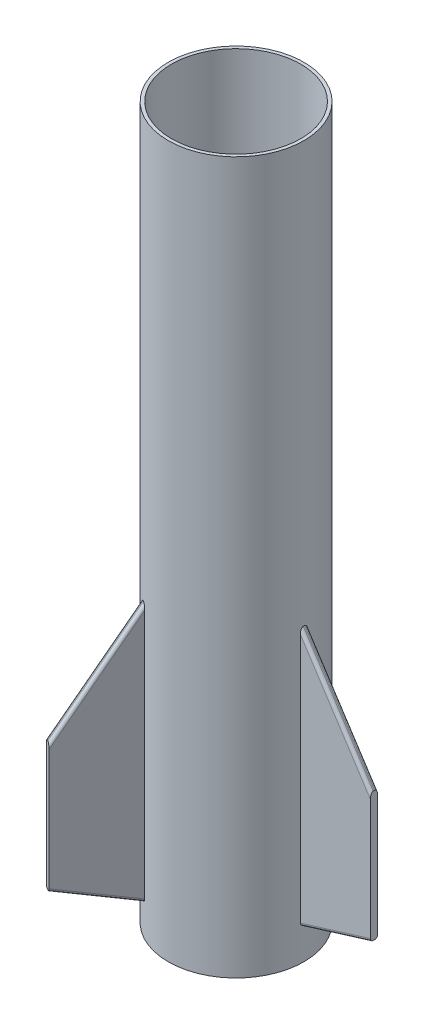
ISO-10303-21;
HEADER;
FILE_DESCRIPTION(('STEP AP214'),'2;1');
FILE_NAME('part.step','',(''),(''),'','','');
FILE_SCHEMA(('AUTOMOTIVE_DESIGN { 1 0 10303 214 1 1 1 1 }'));
ENDSEC;
DATA;
#1=APPLICATION_CONTEXT('core data for automotive mechanical design processes');
#2=APPLICATION_PROTOCOL_DEFINITION('international standard','automotive_design',2000,#1);
#3=PRODUCT_CONTEXT('',#1,'mechanical');
#4=PRODUCT('Part','Part','',(#3));
#5=PRODUCT_RELATED_PRODUCT_CATEGORY('part','',(#4));
#6=PRODUCT_DEFINITION_FORMATION('','',#4);
#7=PRODUCT_DEFINITION_CONTEXT('part definition',#1,'design');
#8=PRODUCT_DEFINITION('design','',#6,#7);
#9=PRODUCT_DEFINITION_SHAPE('','',#8);
#10=(LENGTH_UNIT() NAMED_UNIT(*) SI_UNIT(.MILLI.,.METRE.));
#11=(NAMED_UNIT(*) PLANE_ANGLE_UNIT() SI_UNIT($,.RADIAN.));
#12=(NAMED_UNIT(*) SI_UNIT($,.STERADIAN.) SOLID_ANGLE_UNIT());
#13=UNCERTAINTY_MEASURE_WITH_UNIT(LENGTH_MEASURE(1.E-05),#10,'distance_accuracy_value','');
#14=(GEOMETRIC_REPRESENTATION_CONTEXT(3) GLOBAL_UNCERTAINTY_ASSIGNED_CONTEXT((#13)) GLOBAL_UNIT_ASSIGNED_CONTEXT((#10,
#11,#12)) REPRESENTATION_CONTEXT('',''));
#15=CARTESIAN_POINT('',(0.,0.,0.));
#16=DIRECTION('',(0.,0.,1.));
#17=DIRECTION('',(1.,0.,0.));
#18=AXIS2_PLACEMENT_3D('',#15,#16,#17);
#19=CARTESIAN_POINT('',(-42.50974884677,31.75,-69.3110448195996));
#20=DIRECTION('',(-0.147042924418759,-0.95577900872195,-0.254685815986807));
#21=DIRECTION('',(-0.477889504360967,0.294085848837523,-0.827728901957122));
#22=AXIS2_PLACEMENT_3D('',#19,#20,#21);
#23=PLANE('',#22);
#24=DIRECTION('',(0.866025403784443,0.,-0.499999999999992));
#25=VECTOR('',#24,1.);
#26=CARTESIAN_POINT('',(-42.50974884677,31.75,-69.3110448195996));
#27=LINE('',#26,#25);
#28=CARTESIAN_POINT('',(-40.9699556788412,31.75,-70.2000448195996));
#29=VERTEX_POINT('',#28);
#30=CARTESIAN_POINT('',(-40.3100443211575,31.75,-70.5810448195996));
#31=VERTEX_POINT('',#30);
#32=EDGE_CURVE('E149',#29,#31,#27,.T.);
#33=ORIENTED_EDGE('',*,*,#32,.T.);
#34=DIRECTION('',(-0.477889504360967,0.294085848837523,-0.827728901957122));
#35=VECTOR('',#34,1.);
#36=CARTESIAN_POINT('',(-40.3100443211575,31.75,-70.5810448195996));
#37=LINE('',#36,#35);
#38=CARTESIAN_POINT('',(-19.6725443211578,19.05,-34.8358462783967));
#39=VERTEX_POINT('',#38);
#40=EDGE_CURVE('E117',#31,#39,#37,.F.);
#41=ORIENTED_EDGE('',*,*,#40,.T.);
#42=DIRECTION('',(0.866025403784443,0.,-0.499999999999992));
#43=VECTOR('',#42,1.);
#44=CARTESIAN_POINT('',(-21.8722488467703,19.05,-33.5658462783967));
#45=LINE('',#44,#43);
#46=CARTESIAN_POINT('',(-20.3324556788416,19.05,-34.4548462783967));
#47=VERTEX_POINT('',#46);
#48=EDGE_CURVE('E150',#47,#39,#45,.T.);
#49=ORIENTED_EDGE('',*,*,#48,.F.);
#50=DIRECTION('',(-0.477889504360967,0.294085848837523,-0.827728901957122));
#51=VECTOR('',#50,1.);
#52=CARTESIAN_POINT('',(-40.9699556788412,31.75,-70.2000448195996));
#53=LINE('',#52,#51);
#54=EDGE_CURVE('E122',#47,#29,#53,.T.);
#55=ORIENTED_EDGE('',*,*,#54,.T.);
#56=EDGE_LOOP('',(#33,#41,#49,#55));
#57=FACE_BOUND('',#56,.T.);
#58=ADVANCED_FACE('F47',(#57),#23,.T.);
#59=CARTESIAN_POINT('',(-21.8722488467703,19.05,-33.5658462783967));
#60=DIRECTION('',(0.499999999999992,0.,0.866025403784443));
#61=DIRECTION('',(0.866025403784443,0.,-0.499999999999992));
#62=AXIS2_PLACEMENT_3D('',#59,#60,#61);
#63=PLANE('',#62);
#64=ORIENTED_EDGE('',*,*,#48,.T.);
#65=CARTESIAN_POINT('',(-19.6725443211578,20.9102626588101,-34.8358462783967));
#66=DIRECTION('',(0.499999999999992,0.,0.866025403784443));
#67=DIRECTION('',(0.,1.,0.));
#68=AXIS2_PLACEMENT_3D('',#65,#66,#67);
#69=ELLIPSE('',#68,1.86026265881012,1.778);
#70=CARTESIAN_POINT('',(-18.1327511532291,20.9102626588101,-35.7248462783966));
#71=VERTEX_POINT('',#70);
#72=EDGE_CURVE('E171',#39,#71,#69,.T.);
#73=ORIENTED_EDGE('',*,*,#72,.T.);
#74=DIRECTION('',(0.,-1.,0.));
#75=VECTOR('',#74,1.);
#76=CARTESIAN_POINT('',(-18.1327511532291,19.05,-35.7248462783966));
#77=LINE('',#76,#75);
#78=CARTESIAN_POINT('',(-18.1327511532291,168.187544943745,-35.7248462783966));
#79=VERTEX_POINT('',#78);
#80=EDGE_CURVE('E133',#79,#71,#77,.T.);
#81=ORIENTED_EDGE('',*,*,#80,.F.);
#82=CARTESIAN_POINT('',(-19.6725443211578,168.187544943745,-34.8358462783967));
#83=DIRECTION('',(0.499999999999992,0.,0.866025403784443));
#84=DIRECTION('',(0.,1.,0.));
#85=AXIS2_PLACEMENT_3D('',#82,#83,#84);
#86=ELLIPSE('',#85,3.26245505625485,1.778);
#87=CARTESIAN_POINT('',(-19.6725443211578,171.45,-34.8358462783967));
#88=VERTEX_POINT('',#87);
#89=EDGE_CURVE('E167',#79,#88,#86,.T.);
#90=ORIENTED_EDGE('',*,*,#89,.T.);
#91=DIRECTION('',(0.866025403784443,0.,-0.499999999999992));
#92=VECTOR('',#91,1.);
#93=CARTESIAN_POINT('',(-21.8722488467703,171.45,-33.5658462783967));
#94=LINE('',#93,#92);
#95=CARTESIAN_POINT('',(-20.3324556788416,171.45,-34.4548462783967));
#96=VERTEX_POINT('',#95);
#97=EDGE_CURVE('E153',#96,#88,#94,.T.);
#98=ORIENTED_EDGE('',*,*,#97,.F.);
#99=CARTESIAN_POINT('',(-20.3324556788416,168.187544943745,-34.4548462783967));
#100=DIRECTION('',(0.499999999999992,0.,0.866025403784443));
#101=DIRECTION('',(0.,-1.,0.));
#102=AXIS2_PLACEMENT_3D('',#99,#100,#101);
#103=ELLIPSE('',#102,3.26245505625485,1.778);
#104=CARTESIAN_POINT('',(-21.8722488467703,168.187544943745,-33.5658462783967));
#105=VERTEX_POINT('',#104);
#106=EDGE_CURVE('E69',#96,#105,#103,.T.);
#107=ORIENTED_EDGE('',*,*,#106,.T.);
#108=DIRECTION('',(0.,-1.,0.));
#109=VECTOR('',#108,1.);
#110=CARTESIAN_POINT('',(-21.8722488467703,19.05,-33.5658462783967));
#111=LINE('',#110,#109);
#112=CARTESIAN_POINT('',(-21.8722488467703,20.9102626588101,-33.5658462783967));
#113=VERTEX_POINT('',#112);
#114=EDGE_CURVE('E147',#105,#113,#111,.T.);
#115=ORIENTED_EDGE('',*,*,#114,.T.);
#116=CARTESIAN_POINT('',(-20.3324556788416,20.9102626588101,-34.4548462783967));
#117=DIRECTION('',(0.499999999999992,0.,0.866025403784443));
#118=DIRECTION('',(0.,-1.,0.));
#119=AXIS2_PLACEMENT_3D('',#116,#117,#118);
#120=ELLIPSE('',#119,1.86026265881012,1.778);
#121=EDGE_CURVE('E169',#113,#47,#120,.T.);
#122=ORIENTED_EDGE('',*,*,#121,.T.);
#123=EDGE_LOOP('',(#64,#73,#81,#90,#98,#107,#115,#122));
#124=FACE_BOUND('',#123,.T.);
#125=ADVANCED_FACE('F183',(#124),#63,.T.);
#126=CARTESIAN_POINT('',(-21.8722488467703,171.45,-33.5658462783967));
#127=DIRECTION('',(-0.419221808150312,0.544988350595414,-0.726113471357248));
#128=DIRECTION('',(0.272494175297703,0.838443616300637,0.471973756382211));
#129=AXIS2_PLACEMENT_3D('',#126,#127,#128);
#130=PLANE('',#129);
#131=ORIENTED_EDGE('',*,*,#97,.T.);
#132=DIRECTION('',(0.272494175297703,0.838443616300637,0.471973756382211));
#133=VECTOR('',#132,1.);
#134=CARTESIAN_POINT('',(-19.6725443211578,171.45,-34.8358462783967));
#135=LINE('',#134,#133);
#136=CARTESIAN_POINT('',(-40.3100443211575,107.95,-70.5810448195995));
#137=VERTEX_POINT('',#136);
#138=EDGE_CURVE('E12',#88,#137,#135,.F.);
#139=ORIENTED_EDGE('',*,*,#138,.T.);
#140=DIRECTION('',(0.866025403784443,0.,-0.499999999999992));
#141=VECTOR('',#140,1.);
#142=CARTESIAN_POINT('',(-42.50974884677,107.95,-69.3110448195996));
#143=LINE('',#142,#141);
#144=CARTESIAN_POINT('',(-40.9699556788412,107.95,-70.2000448195995));
#145=VERTEX_POINT('',#144);
#146=EDGE_CURVE('E156',#145,#137,#143,.T.);
#147=ORIENTED_EDGE('',*,*,#146,.F.);
#148=DIRECTION('',(0.272494175297703,0.838443616300637,0.471973756382211));
#149=VECTOR('',#148,1.);
#150=CARTESIAN_POINT('',(-20.3324556788416,171.45,-34.4548462783967));
#151=LINE('',#150,#149);
#152=EDGE_CURVE('E55',#145,#96,#151,.T.);
#153=ORIENTED_EDGE('',*,*,#152,.T.);
#154=EDGE_LOOP('',(#131,#139,#147,#153));
#155=FACE_BOUND('',#154,.T.);
#156=ADVANCED_FACE('F179',(#155),#130,.T.);
#157=CARTESIAN_POINT('',(-42.50974884677,107.95,-69.3110448195996));
#158=DIRECTION('',(-0.499999999999992,0.,-0.866025403784443));
#159=DIRECTION('',(0.,1.,0.));
#160=AXIS2_PLACEMENT_3D('',#157,#158,#159);
#161=PLANE('',#160);
#162=DIRECTION('',(0.,1.,0.));
#163=VECTOR('',#162,1.);
#164=CARTESIAN_POINT('',(-38.7702511532287,107.95,-71.4700448195995));
#165=LINE('',#164,#163);
#166=CARTESIAN_POINT('',(-38.7702511532287,33.6102626588102,-71.4700448195995));
#167=VERTEX_POINT('',#166);
#168=CARTESIAN_POINT('',(-38.7702511532287,104.687544943745,-71.4700448195995));
#169=VERTEX_POINT('',#168);
#170=EDGE_CURVE('E130',#167,#169,#165,.T.);
#171=ORIENTED_EDGE('',*,*,#170,.F.);
#172=CARTESIAN_POINT('',(-40.3100443211575,33.6102626588101,-70.5810448195996));
#173=DIRECTION('',(-0.499999999999992,0.,-0.866025403784443));
#174=DIRECTION('',(0.,1.,0.));
#175=AXIS2_PLACEMENT_3D('',#172,#173,#174);
#176=ELLIPSE('',#175,1.86026265881012,1.778);
#177=EDGE_CURVE('E112',#167,#31,#176,.T.);
#178=ORIENTED_EDGE('',*,*,#177,.T.);
#179=ORIENTED_EDGE('',*,*,#32,.F.);
#180=CARTESIAN_POINT('',(-40.9699556788412,33.6102626588101,-70.2000448195996));
#181=DIRECTION('',(-0.499999999999992,0.,-0.866025403784443));
#182=DIRECTION('',(0.,-1.,0.));
#183=AXIS2_PLACEMENT_3D('',#180,#181,#182);
#184=ELLIPSE('',#183,1.86026265881012,1.778);
#185=CARTESIAN_POINT('',(-42.50974884677,33.6102626588102,-69.3110448195996));
#186=VERTEX_POINT('',#185);
#187=EDGE_CURVE('E123',#29,#186,#184,.T.);
#188=ORIENTED_EDGE('',*,*,#187,.T.);
#189=DIRECTION('',(0.,1.,0.));
#190=VECTOR('',#189,1.);
#191=CARTESIAN_POINT('',(-42.50974884677,107.95,-69.3110448195996));
#192=LINE('',#191,#190);
#193=CARTESIAN_POINT('',(-42.50974884677,104.687544943745,-69.3110448195996));
#194=VERTEX_POINT('',#193);
#195=EDGE_CURVE('E142',#186,#194,#192,.T.);
#196=ORIENTED_EDGE('',*,*,#195,.T.);
#197=CARTESIAN_POINT('',(-40.9699556788412,104.687544943745,-70.2000448195995));
#198=DIRECTION('',(-0.499999999999992,0.,-0.866025403784443));
#199=DIRECTION('',(0.,-1.,0.));
#200=AXIS2_PLACEMENT_3D('',#197,#198,#199);
#201=ELLIPSE('',#200,3.26245505625485,1.778);
#202=EDGE_CURVE('E134',#194,#145,#201,.T.);
#203=ORIENTED_EDGE('',*,*,#202,.T.);
#204=ORIENTED_EDGE('',*,*,#146,.T.);
#205=CARTESIAN_POINT('',(-40.3100443211575,104.687544943745,-70.5810448195995));
#206=DIRECTION('',(-0.499999999999992,0.,-0.866025403784443));
#207=DIRECTION('',(0.,1.,0.));
#208=AXIS2_PLACEMENT_3D('',#205,#206,#207);
#209=ELLIPSE('',#208,3.26245505625485,1.778);
#210=EDGE_CURVE('E140',#137,#169,#209,.T.);
#211=ORIENTED_EDGE('',*,*,#210,.T.);
#212=EDGE_LOOP('',(#171,#178,#179,#188,#196,#203,#204,#211));
#213=FACE_BOUND('',#212,.T.);
#214=ADVANCED_FACE('F137',(#213),#161,.T.);
#215=CARTESIAN_POINT('',(-1.86974884677061,0.,1.07949999999998));
#216=DIRECTION('',(0.866025403784443,0.,-0.499999999999992));
#217=DIRECTION('',(-0.499999999999992,0.,-0.866025403784443));
#218=AXIS2_PLACEMENT_3D('',#215,#216,#217);
#219=PLANE('',#218);
#220=ORIENTED_EDGE('',*,*,#195,.F.);
#221=DIRECTION('',(-0.477889504360967,0.294085848837523,-0.827728901957122));
#222=VECTOR('',#221,1.);
#223=CARTESIAN_POINT('',(-21.6108065271537,20.7493750775076,-33.1130148975721));
#224=LINE('',#223,#222);
#225=EDGE_CURVE('E62',#186,#113,#224,.F.);
#226=ORIENTED_EDGE('',*,*,#225,.T.);
#227=ORIENTED_EDGE('',*,*,#114,.F.);
#228=DIRECTION('',(0.272494175297703,0.838443616300637,0.471973756382211));
#229=VECTOR('',#228,1.);
#230=CARTESIAN_POINT('',(-41.7643724718787,106.981010712641,-68.0200150675264));
#231=LINE('',#230,#229);
#232=EDGE_CURVE('E173',#105,#194,#231,.F.);
#233=ORIENTED_EDGE('',*,*,#232,.T.);
#234=EDGE_LOOP('',(#220,#226,#227,#233));
#235=FACE_BOUND('',#234,.T.);
#236=ADVANCED_FACE('F187',(#235),#219,.F.);
#237=CARTESIAN_POINT('',(1.86974884677061,0.,-1.07949999999998));
#238=DIRECTION('',(0.866025403784443,0.,-0.499999999999992));
#239=DIRECTION('',(-0.499999999999992,0.,-0.866025403784443));
#240=AXIS2_PLACEMENT_3D('',#237,#238,#239);
#241=PLANE('',#240);
#242=ORIENTED_EDGE('',*,*,#80,.T.);
#243=DIRECTION('',(-0.477889504360967,0.294085848837523,-0.827728901957122));
#244=VECTOR('',#243,1.);
#245=CARTESIAN_POINT('',(3.0785425177385,7.85715886129141,1.01419205398414));
#246=LINE('',#245,#244);
#247=EDGE_CURVE('E116',#71,#167,#246,.T.);
#248=ORIENTED_EDGE('',*,*,#247,.T.);
#249=ORIENTED_EDGE('',*,*,#170,.T.);
#250=DIRECTION('',(0.272494175297703,0.838443616300637,0.471973756382211));
#251=VECTOR('',#250,1.);
#252=CARTESIAN_POINT('',(-50.6177394532055,68.2337347899699,-91.9904964972375));
#253=LINE('',#252,#251);
#254=EDGE_CURVE('E135',#169,#79,#253,.T.);
#255=ORIENTED_EDGE('',*,*,#254,.T.);
#256=EDGE_LOOP('',(#242,#248,#249,#255));
#257=FACE_BOUND('',#256,.T.);
#258=ADVANCED_FACE('F128',(#257),#241,.T.);
#259=CARTESIAN_POINT('',(1.53874934980976,7.85715886129141,1.90319205398413));
#260=DIRECTION('',(-0.477889504360967,0.294085848837523,-0.827728901957122));
#261=DIRECTION('',(0.147042924418759,0.95577900872195,0.254685815986807));
#262=AXIS2_PLACEMENT_3D('',#259,#260,#261);
#263=CYLINDRICAL_SURFACE('',#262,1.778);
#264=ORIENTED_EDGE('',*,*,#72,.F.);
#265=ORIENTED_EDGE('',*,*,#40,.F.);
#266=ORIENTED_EDGE('',*,*,#177,.F.);
#267=ORIENTED_EDGE('',*,*,#247,.F.);
#268=EDGE_LOOP('',(#264,#265,#266,#267));
#269=FACE_BOUND('',#268,.T.);
#270=ADVANCED_FACE('F115',(#269),#263,.T.);
#271=CARTESIAN_POINT('',(-40.7085133592247,33.4493750775076,-69.747213438775));
#272=DIRECTION('',(0.477889504360967,-0.294085848837523,0.827728901957122));
#273=DIRECTION('',(-0.147042924418759,-0.95577900872195,-0.254685815986807));
#274=AXIS2_PLACEMENT_3D('',#271,#272,#273);
#275=CYLINDRICAL_SURFACE('',#274,1.778);
#276=ORIENTED_EDGE('',*,*,#121,.F.);
#277=ORIENTED_EDGE('',*,*,#225,.F.);
#278=ORIENTED_EDGE('',*,*,#187,.F.);
#279=ORIENTED_EDGE('',*,*,#54,.F.);
#280=EDGE_LOOP('',(#276,#277,#278,#279));
#281=FACE_BOUND('',#280,.T.);
#282=ADVANCED_FACE('F192',(#281),#275,.T.);
#283=CARTESIAN_POINT('',(-52.1575326211342,68.23373478997,-91.1014964972375));
#284=DIRECTION('',(0.272494175297703,0.838443616300637,0.471973756382211));
#285=DIRECTION('',(0.419221808150312,-0.544988350595414,0.726113471357248));
#286=AXIS2_PLACEMENT_3D('',#283,#284,#285);
#287=CYLINDRICAL_SURFACE('',#286,1.778);
#288=ORIENTED_EDGE('',*,*,#210,.F.);
#289=ORIENTED_EDGE('',*,*,#138,.F.);
#290=ORIENTED_EDGE('',*,*,#89,.F.);
#291=ORIENTED_EDGE('',*,*,#254,.F.);
#292=EDGE_LOOP('',(#288,#289,#290,#291));
#293=FACE_BOUND('',#292,.T.);
#294=ADVANCED_FACE('F185',(#293),#287,.T.);
#295=CARTESIAN_POINT('',(-19.5870793039503,170.481010712641,-33.1638165263235));
#296=DIRECTION('',(-0.272494175297703,-0.838443616300637,-0.471973756382211));
#297=DIRECTION('',(-0.419221808150312,0.544988350595414,-0.726113471357248));
#298=AXIS2_PLACEMENT_3D('',#295,#296,#297);
#299=CYLINDRICAL_SURFACE('',#298,1.778);
#300=ORIENTED_EDGE('',*,*,#202,.F.);
#301=ORIENTED_EDGE('',*,*,#232,.F.);
#302=ORIENTED_EDGE('',*,*,#106,.F.);
#303=ORIENTED_EDGE('',*,*,#152,.F.);
#304=EDGE_LOOP('',(#300,#301,#302,#303));
#305=FACE_BOUND('',#304,.T.);
#306=ADVANCED_FACE('F49',(#305),#299,.T.);
#307=CLOSED_SHELL('',(#58,#125,#156,#214,#236,#258,#270,#282,#294,#306));
#308=MANIFOLD_SOLID_BREP('B2',#307);
#309=CARTESIAN_POINT('',(-38.7702511532297,31.75,71.470044819599));
#310=DIRECTION('',(-0.147042924418763,-0.95577900872195,0.254685815986805));
#311=DIRECTION('',(-0.477889504360979,0.294085848837523,0.827728901957115));
#312=AXIS2_PLACEMENT_3D('',#309,#310,#311);
#313=PLANE('',#312);
#314=DIRECTION('',(-0.866025403784436,0.,-0.500000000000004));
#315=VECTOR('',#314,1.);
#316=CARTESIAN_POINT('',(-38.7702511532297,31.75,71.470044819599));
#317=LINE('',#316,#315);
#318=CARTESIAN_POINT('',(-40.3100443211585,31.75,70.581044819599));
#319=VERTEX_POINT('',#318);
#320=CARTESIAN_POINT('',(-40.9699556788422,31.75,70.200044819599));
#321=VERTEX_POINT('',#320);
#322=EDGE_CURVE('E386',#319,#321,#317,.T.);
#323=ORIENTED_EDGE('',*,*,#322,.T.);
#324=DIRECTION('',(-0.477889504360979,0.294085848837523,0.827728901957115));
#325=VECTOR('',#324,1.);
#326=CARTESIAN_POINT('',(-40.9699556788422,31.75,70.200044819599));
#327=LINE('',#326,#325);
#328=CARTESIAN_POINT('',(-20.332455678842,19.05,34.4548462783964));
#329=VERTEX_POINT('',#328);
#330=EDGE_CURVE('E354',#321,#329,#327,.F.);
#331=ORIENTED_EDGE('',*,*,#330,.T.);
#332=DIRECTION('',(-0.866025403784436,0.,-0.500000000000004));
#333=VECTOR('',#332,1.);
#334=CARTESIAN_POINT('',(-18.1327511532296,19.05,35.7248462783964));
#335=LINE('',#334,#333);
#336=CARTESIAN_POINT('',(-19.6725443211583,19.05,34.8358462783964));
#337=VERTEX_POINT('',#336);
#338=EDGE_CURVE('E387',#337,#329,#335,.T.);
#339=ORIENTED_EDGE('',*,*,#338,.F.);
#340=DIRECTION('',(-0.477889504360979,0.294085848837523,0.827728901957115));
#341=VECTOR('',#340,1.);
#342=CARTESIAN_POINT('',(-40.3100443211585,31.75,70.581044819599));
#343=LINE('',#342,#341);
#344=EDGE_CURVE('E359',#337,#319,#343,.T.);
#345=ORIENTED_EDGE('',*,*,#344,.T.);
#346=EDGE_LOOP('',(#323,#331,#339,#345));
#347=FACE_BOUND('',#346,.T.);
#348=ADVANCED_FACE('F284',(#347),#313,.T.);
#349=CARTESIAN_POINT('',(-18.1327511532296,19.05,35.7248462783964));
#350=DIRECTION('',(0.500000000000004,0.,-0.866025403784436));
#351=DIRECTION('',(-0.866025403784436,0.,-0.500000000000004));
#352=AXIS2_PLACEMENT_3D('',#349,#350,#351);
#353=PLANE('',#352);
#354=ORIENTED_EDGE('',*,*,#338,.T.);
#355=CARTESIAN_POINT('',(-20.332455678842,20.9102626588101,34.4548462783964));
#356=DIRECTION('',(0.500000000000004,0.,-0.866025403784436));
#357=DIRECTION('',(0.,1.,0.));
#358=AXIS2_PLACEMENT_3D('',#355,#356,#357);
#359=ELLIPSE('',#358,1.86026265881012,1.778);
#360=CARTESIAN_POINT('',(-21.8722488467708,20.9102626588101,33.5658462783964));
#361=VERTEX_POINT('',#360);
#362=EDGE_CURVE('E408',#329,#361,#359,.T.);
#363=ORIENTED_EDGE('',*,*,#362,.T.);
#364=DIRECTION('',(0.,-1.,0.));
#365=VECTOR('',#364,1.);
#366=CARTESIAN_POINT('',(-21.8722488467708,19.05,33.5658462783964));
#367=LINE('',#366,#365);
#368=CARTESIAN_POINT('',(-21.8722488467708,168.187544943745,33.5658462783964));
#369=VERTEX_POINT('',#368);
#370=EDGE_CURVE('E370',#369,#361,#367,.T.);
#371=ORIENTED_EDGE('',*,*,#370,.F.);
#372=CARTESIAN_POINT('',(-20.332455678842,168.187544943745,34.4548462783964));
#373=DIRECTION('',(0.500000000000004,0.,-0.866025403784436));
#374=DIRECTION('',(0.,1.,0.));
#375=AXIS2_PLACEMENT_3D('',#372,#373,#374);
#376=ELLIPSE('',#375,3.26245505625485,1.778);
#377=CARTESIAN_POINT('',(-20.332455678842,171.45,34.4548462783964));
#378=VERTEX_POINT('',#377);
#379=EDGE_CURVE('E404',#369,#378,#376,.T.);
#380=ORIENTED_EDGE('',*,*,#379,.T.);
#381=DIRECTION('',(-0.866025403784436,0.,-0.500000000000004));
#382=VECTOR('',#381,1.);
#383=CARTESIAN_POINT('',(-18.1327511532296,171.45,35.7248462783964));
#384=LINE('',#383,#382);
#385=CARTESIAN_POINT('',(-19.6725443211583,171.45,34.8358462783964));
#386=VERTEX_POINT('',#385);
#387=EDGE_CURVE('E390',#386,#378,#384,.T.);
#388=ORIENTED_EDGE('',*,*,#387,.F.);
#389=CARTESIAN_POINT('',(-19.6725443211583,168.187544943745,34.8358462783964));
#390=DIRECTION('',(0.500000000000004,0.,-0.866025403784436));
#391=DIRECTION('',(0.,-1.,0.));
#392=AXIS2_PLACEMENT_3D('',#389,#390,#391);
#393=ELLIPSE('',#392,3.26245505625485,1.778);
#394=CARTESIAN_POINT('',(-18.1327511532296,168.187544943745,35.7248462783964));
#395=VERTEX_POINT('',#394);
#396=EDGE_CURVE('E306',#386,#395,#393,.T.);
#397=ORIENTED_EDGE('',*,*,#396,.T.);
#398=DIRECTION('',(0.,-1.,0.));
#399=VECTOR('',#398,1.);
#400=CARTESIAN_POINT('',(-18.1327511532296,19.05,35.7248462783964));
#401=LINE('',#400,#399);
#402=CARTESIAN_POINT('',(-18.1327511532296,20.9102626588101,35.7248462783964));
#403=VERTEX_POINT('',#402);
#404=EDGE_CURVE('E384',#395,#403,#401,.T.);
#405=ORIENTED_EDGE('',*,*,#404,.T.);
#406=CARTESIAN_POINT('',(-19.6725443211583,20.9102626588101,34.8358462783964));
#407=DIRECTION('',(0.500000000000004,0.,-0.866025403784436));
#408=DIRECTION('',(0.,-1.,0.));
#409=AXIS2_PLACEMENT_3D('',#406,#407,#408);
#410=ELLIPSE('',#409,1.86026265881012,1.778);
#411=EDGE_CURVE('E406',#403,#337,#410,.T.);
#412=ORIENTED_EDGE('',*,*,#411,.T.);
#413=EDGE_LOOP('',(#354,#363,#371,#380,#388,#397,#405,#412));
#414=FACE_BOUND('',#413,.T.);
#415=ADVANCED_FACE('F420',(#414),#353,.T.);
#416=CARTESIAN_POINT('',(-18.1327511532296,171.45,35.7248462783964));
#417=DIRECTION('',(-0.419221808150322,0.544988350595414,0.726113471357242));
#418=DIRECTION('',(0.272494175297709,0.838443616300637,-0.471973756382207));
#419=AXIS2_PLACEMENT_3D('',#416,#417,#418);
#420=PLANE('',#419);
#421=ORIENTED_EDGE('',*,*,#387,.T.);
#422=DIRECTION('',(0.272494175297709,0.838443616300637,-0.471973756382207));
#423=VECTOR('',#422,1.);
#424=CARTESIAN_POINT('',(-20.332455678842,171.45,34.4548462783964));
#425=LINE('',#424,#423);
#426=CARTESIAN_POINT('',(-40.9699556788422,107.95,70.200044819599));
#427=VERTEX_POINT('',#426);
#428=EDGE_CURVE('E45',#378,#427,#425,.F.);
#429=ORIENTED_EDGE('',*,*,#428,.T.);
#430=DIRECTION('',(-0.866025403784436,0.,-0.500000000000004));
#431=VECTOR('',#430,1.);
#432=CARTESIAN_POINT('',(-38.7702511532297,107.95,71.470044819599));
#433=LINE('',#432,#431);
#434=CARTESIAN_POINT('',(-40.3100443211585,107.95,70.581044819599));
#435=VERTEX_POINT('',#434);
#436=EDGE_CURVE('E393',#435,#427,#433,.T.);
#437=ORIENTED_EDGE('',*,*,#436,.F.);
#438=DIRECTION('',(0.272494175297709,0.838443616300637,-0.471973756382207));
#439=VECTOR('',#438,1.);
#440=CARTESIAN_POINT('',(-19.6725443211583,171.45,34.8358462783964));
#441=LINE('',#440,#439);
#442=EDGE_CURVE('E292',#435,#386,#441,.T.);
#443=ORIENTED_EDGE('',*,*,#442,.T.);
#444=EDGE_LOOP('',(#421,#429,#437,#443));
#445=FACE_BOUND('',#444,.T.);
#446=ADVANCED_FACE('F416',(#445),#420,.T.);
#447=CARTESIAN_POINT('',(-38.7702511532297,107.95,71.470044819599));
#448=DIRECTION('',(-0.500000000000004,0.,0.866025403784436));
#449=DIRECTION('',(0.,1.,0.));
#450=AXIS2_PLACEMENT_3D('',#447,#448,#449);
#451=PLANE('',#450);
#452=DIRECTION('',(0.,1.,0.));
#453=VECTOR('',#452,1.);
#454=CARTESIAN_POINT('',(-42.5097488467709,107.95,69.311044819599));
#455=LINE('',#454,#453);
#456=CARTESIAN_POINT('',(-42.5097488467709,33.6102626588102,69.311044819599));
#457=VERTEX_POINT('',#456);
#458=CARTESIAN_POINT('',(-42.5097488467709,104.687544943745,69.311044819599));
#459=VERTEX_POINT('',#458);
#460=EDGE_CURVE('E367',#457,#459,#455,.T.);
#461=ORIENTED_EDGE('',*,*,#460,.F.);
#462=CARTESIAN_POINT('',(-40.9699556788422,33.6102626588101,70.200044819599));
#463=DIRECTION('',(-0.500000000000004,0.,0.866025403784436));
#464=DIRECTION('',(0.,1.,0.));
#465=AXIS2_PLACEMENT_3D('',#462,#463,#464);
#466=ELLIPSE('',#465,1.86026265881012,1.778);
#467=EDGE_CURVE('E349',#457,#321,#466,.T.);
#468=ORIENTED_EDGE('',*,*,#467,.T.);
#469=ORIENTED_EDGE('',*,*,#322,.F.);
#470=CARTESIAN_POINT('',(-40.3100443211585,33.6102626588101,70.581044819599));
#471=DIRECTION('',(-0.500000000000004,0.,0.866025403784436));
#472=DIRECTION('',(0.,-1.,0.));
#473=AXIS2_PLACEMENT_3D('',#470,#471,#472);
#474=ELLIPSE('',#473,1.86026265881012,1.778);
#475=CARTESIAN_POINT('',(-38.7702511532297,33.6102626588102,71.470044819599));
#476=VERTEX_POINT('',#475);
#477=EDGE_CURVE('E360',#319,#476,#474,.T.);
#478=ORIENTED_EDGE('',*,*,#477,.T.);
#479=DIRECTION('',(0.,1.,0.));
#480=VECTOR('',#479,1.);
#481=CARTESIAN_POINT('',(-38.7702511532297,107.95,71.470044819599));
#482=LINE('',#481,#480);
#483=CARTESIAN_POINT('',(-38.7702511532297,104.687544943745,71.470044819599));
#484=VERTEX_POINT('',#483);
#485=EDGE_CURVE('E379',#476,#484,#482,.T.);
#486=ORIENTED_EDGE('',*,*,#485,.T.);
#487=CARTESIAN_POINT('',(-40.3100443211585,104.687544943745,70.581044819599));
#488=DIRECTION('',(-0.500000000000004,0.,0.866025403784436));
#489=DIRECTION('',(0.,-1.,0.));
#490=AXIS2_PLACEMENT_3D('',#487,#488,#489);
#491=ELLIPSE('',#490,3.26245505625485,1.778);
#492=EDGE_CURVE('E371',#484,#435,#491,.T.);
#493=ORIENTED_EDGE('',*,*,#492,.T.);
#494=ORIENTED_EDGE('',*,*,#436,.T.);
#495=CARTESIAN_POINT('',(-40.9699556788422,104.687544943745,70.200044819599));
#496=DIRECTION('',(-0.500000000000004,0.,0.866025403784436));
#497=DIRECTION('',(0.,1.,0.));
#498=AXIS2_PLACEMENT_3D('',#495,#496,#497);
#499=ELLIPSE('',#498,3.26245505625485,1.778);
#500=EDGE_CURVE('E377',#427,#459,#499,.T.);
#501=ORIENTED_EDGE('',*,*,#500,.T.);
#502=EDGE_LOOP('',(#461,#468,#469,#478,#486,#493,#494,#501));
#503=FACE_BOUND('',#502,.T.);
#504=ADVANCED_FACE('F374',(#503),#451,.T.);
#505=CARTESIAN_POINT('',(1.8697488467706,0.,1.07950000000001));
#506=DIRECTION('',(-0.866025403784436,0.,-0.500000000000004));
#507=DIRECTION('',(-0.500000000000004,0.,0.866025403784436));
#508=AXIS2_PLACEMENT_3D('',#505,#506,#507);
#509=PLANE('',#508);
#510=ORIENTED_EDGE('',*,*,#485,.F.);
#511=DIRECTION('',(-0.477889504360979,0.294085848837523,0.827728901957115));
#512=VECTOR('',#511,1.);
#513=CARTESIAN_POINT('',(-17.871308833613,20.7493750775076,35.2720148975719));
#514=LINE('',#513,#512);
#515=EDGE_CURVE('E299',#476,#403,#514,.F.);
#516=ORIENTED_EDGE('',*,*,#515,.T.);
#517=ORIENTED_EDGE('',*,*,#404,.F.);
#518=DIRECTION('',(0.272494175297709,0.838443616300637,-0.471973756382207));
#519=VECTOR('',#518,1.);
#520=CARTESIAN_POINT('',(-38.0248747783385,106.981010712641,70.1790150675258));
#521=LINE('',#520,#519);
#522=EDGE_CURVE('E410',#395,#484,#521,.F.);
#523=ORIENTED_EDGE('',*,*,#522,.T.);
#524=EDGE_LOOP('',(#510,#516,#517,#523));
#525=FACE_BOUND('',#524,.T.);
#526=ADVANCED_FACE('F424',(#525),#509,.F.);
#527=CARTESIAN_POINT('',(-1.8697488467706,0.,-1.07950000000001));
#528=DIRECTION('',(-0.866025403784436,0.,-0.500000000000004));
#529=DIRECTION('',(-0.500000000000004,0.,0.866025403784436));
#530=AXIS2_PLACEMENT_3D('',#527,#528,#529);
#531=PLANE('',#530);
#532=ORIENTED_EDGE('',*,*,#370,.T.);
#533=DIRECTION('',(-0.477889504360979,0.294085848837523,0.827728901957115));
#534=VECTOR('',#533,1.);
#535=CARTESIAN_POINT('',(-0.660955175802679,7.85715886129141,-3.17319205398412));
#536=LINE('',#535,#534);
#537=EDGE_CURVE('E353',#361,#457,#536,.T.);
#538=ORIENTED_EDGE('',*,*,#537,.T.);
#539=ORIENTED_EDGE('',*,*,#460,.T.);
#540=DIRECTION('',(0.272494175297709,0.838443616300637,-0.471973756382207));
#541=VECTOR('',#540,1.);
#542=CARTESIAN_POINT('',(-54.357237146748,68.2337347899699,89.8314964972368));
#543=LINE('',#542,#541);
#544=EDGE_CURVE('E372',#459,#369,#543,.T.);
#545=ORIENTED_EDGE('',*,*,#544,.T.);
#546=EDGE_LOOP('',(#532,#538,#539,#545));
#547=FACE_BOUND('',#546,.T.);
#548=ADVANCED_FACE('F365',(#547),#531,.T.);
#549=CARTESIAN_POINT('',(0.878837992126049,7.85715886129141,-2.28419205398411));
#550=DIRECTION('',(-0.477889504360979,0.294085848837523,0.827728901957115));
#551=DIRECTION('',(0.147042924418763,0.95577900872195,-0.254685815986805));
#552=AXIS2_PLACEMENT_3D('',#549,#550,#551);
#553=CYLINDRICAL_SURFACE('',#552,1.778);
#554=ORIENTED_EDGE('',*,*,#362,.F.);
#555=ORIENTED_EDGE('',*,*,#330,.F.);
#556=ORIENTED_EDGE('',*,*,#467,.F.);
#557=ORIENTED_EDGE('',*,*,#537,.F.);
#558=EDGE_LOOP('',(#554,#555,#556,#557));
#559=FACE_BOUND('',#558,.T.);
#560=ADVANCED_FACE('F352',(#559),#553,.T.);
#561=CARTESIAN_POINT('',(-40.0486020015419,33.4493750775076,70.1282134387745));
#562=DIRECTION('',(0.477889504360979,-0.294085848837523,-0.827728901957115));
#563=DIRECTION('',(-0.147042924418763,-0.95577900872195,0.254685815986805));
#564=AXIS2_PLACEMENT_3D('',#561,#562,#563);
#565=CYLINDRICAL_SURFACE('',#564,1.778);
#566=ORIENTED_EDGE('',*,*,#411,.F.);
#567=ORIENTED_EDGE('',*,*,#515,.F.);
#568=ORIENTED_EDGE('',*,*,#477,.F.);
#569=ORIENTED_EDGE('',*,*,#344,.F.);
#570=EDGE_LOOP('',(#566,#567,#568,#569));
#571=FACE_BOUND('',#570,.T.);
#572=ADVANCED_FACE('F429',(#571),#565,.T.);
#573=CARTESIAN_POINT('',(-52.8174439788192,68.23373478997,90.7204964972368));
#574=DIRECTION('',(0.272494175297709,0.838443616300637,-0.471973756382207));
#575=DIRECTION('',(0.419221808150322,-0.544988350595414,-0.726113471357243));
#576=AXIS2_PLACEMENT_3D('',#573,#574,#575);
#577=CYLINDRICAL_SURFACE('',#576,1.778);
#578=ORIENTED_EDGE('',*,*,#500,.F.);
#579=ORIENTED_EDGE('',*,*,#428,.F.);
#580=ORIENTED_EDGE('',*,*,#379,.F.);
#581=ORIENTED_EDGE('',*,*,#544,.F.);
#582=EDGE_LOOP('',(#578,#579,#580,#581));
#583=FACE_BOUND('',#582,.T.);
#584=ADVANCED_FACE('F422',(#583),#577,.T.);
#585=CARTESIAN_POINT('',(-18.927167946267,170.481010712641,33.5448165263232));
#586=DIRECTION('',(-0.272494175297709,-0.838443616300637,0.471973756382207));
#587=DIRECTION('',(-0.419221808150322,0.544988350595414,0.726113471357243));
#588=AXIS2_PLACEMENT_3D('',#585,#586,#587);
#589=CYLINDRICAL_SURFACE('',#588,1.778);
#590=ORIENTED_EDGE('',*,*,#492,.F.);
#591=ORIENTED_EDGE('',*,*,#522,.F.);
#592=ORIENTED_EDGE('',*,*,#396,.F.);
#593=ORIENTED_EDGE('',*,*,#442,.F.);
#594=EDGE_LOOP('',(#590,#591,#592,#593));
#595=FACE_BOUND('',#594,.T.);
#596=ADVANCED_FACE('F286',(#595),#589,.T.);
#597=CLOSED_SHELL('',(#348,#415,#446,#504,#526,#548,#560,#572,#584,#596));
#598=MANIFOLD_SOLID_BREP('B6',#597);
#599=CARTESIAN_POINT('',(81.28,31.75,-2.159));
#600=DIRECTION('',(0.294085848837523,-0.95577900872195,0.));
#601=DIRECTION('',(0.95577900872195,0.294085848837523,0.));
#602=AXIS2_PLACEMENT_3D('',#599,#600,#601);
#603=PLANE('',#602);
#604=DIRECTION('',(0.,0.,1.));
#605=VECTOR('',#604,1.);
#606=CARTESIAN_POINT('',(81.28,31.75,-2.159));
#607=LINE('',#606,#605);
#608=CARTESIAN_POINT('',(81.28,31.75,-0.381));
#609=VERTEX_POINT('',#608);
#610=CARTESIAN_POINT('',(81.28,31.75,0.381));
#611=VERTEX_POINT('',#610);
#612=EDGE_CURVE('E620',#609,#611,#607,.T.);
#613=ORIENTED_EDGE('',*,*,#612,.T.);
#614=DIRECTION('',(0.95577900872195,0.294085848837523,0.));
#615=VECTOR('',#614,1.);
#616=CARTESIAN_POINT('',(81.28,31.75,0.381));
#617=LINE('',#616,#615);
#618=CARTESIAN_POINT('',(40.005,19.05,0.381));
#619=VERTEX_POINT('',#618);
#620=EDGE_CURVE('E588',#611,#619,#617,.F.);
#621=ORIENTED_EDGE('',*,*,#620,.T.);
#622=DIRECTION('',(0.,0.,1.));
#623=VECTOR('',#622,1.);
#624=CARTESIAN_POINT('',(40.005,19.05,-2.159));
#625=LINE('',#624,#623);
#626=CARTESIAN_POINT('',(40.005,19.05,-0.381));
#627=VERTEX_POINT('',#626);
#628=EDGE_CURVE('E621',#627,#619,#625,.T.);
#629=ORIENTED_EDGE('',*,*,#628,.F.);
#630=DIRECTION('',(0.95577900872195,0.294085848837523,0.));
#631=VECTOR('',#630,1.);
#632=CARTESIAN_POINT('',(81.28,31.75,-0.381));
#633=LINE('',#632,#631);
#634=EDGE_CURVE('E593',#627,#609,#633,.T.);
#635=ORIENTED_EDGE('',*,*,#634,.T.);
#636=EDGE_LOOP('',(#613,#621,#629,#635));
#637=FACE_BOUND('',#636,.T.);
#638=ADVANCED_FACE('F518',(#637),#603,.T.);
#639=CARTESIAN_POINT('',(40.005,19.05,-2.159));
#640=DIRECTION('',(-1.,0.,0.));
#641=DIRECTION('',(0.,0.,1.));
#642=AXIS2_PLACEMENT_3D('',#639,#640,#641);
#643=PLANE('',#642);
#644=ORIENTED_EDGE('',*,*,#628,.T.);
#645=CARTESIAN_POINT('',(40.005,20.9102626588101,0.381));
#646=DIRECTION('',(-1.,0.,0.));
#647=DIRECTION('',(0.,1.,0.));
#648=AXIS2_PLACEMENT_3D('',#645,#646,#647);
#649=ELLIPSE('',#648,1.86026265881012,1.778);
#650=CARTESIAN_POINT('',(40.005,20.9102626588101,2.159));
#651=VERTEX_POINT('',#650);
#652=EDGE_CURVE('E642',#619,#651,#649,.T.);
#653=ORIENTED_EDGE('',*,*,#652,.T.);
#654=DIRECTION('',(0.,-1.,0.));
#655=VECTOR('',#654,1.);
#656=CARTESIAN_POINT('',(40.005,19.05,2.159));
#657=LINE('',#656,#655);
#658=CARTESIAN_POINT('',(40.005,168.187544943745,2.159));
#659=VERTEX_POINT('',#658);
#660=EDGE_CURVE('E604',#659,#651,#657,.T.);
#661=ORIENTED_EDGE('',*,*,#660,.F.);
#662=CARTESIAN_POINT('',(40.005,168.187544943745,0.381));
#663=DIRECTION('',(-1.,0.,0.));
#664=DIRECTION('',(0.,1.,0.));
#665=AXIS2_PLACEMENT_3D('',#662,#663,#664);
#666=ELLIPSE('',#665,3.26245505625485,1.778);
#667=CARTESIAN_POINT('',(40.005,171.45,0.381));
#668=VERTEX_POINT('',#667);
#669=EDGE_CURVE('E638',#659,#668,#666,.T.);
#670=ORIENTED_EDGE('',*,*,#669,.T.);
#671=DIRECTION('',(0.,0.,1.));
#672=VECTOR('',#671,1.);
#673=CARTESIAN_POINT('',(40.005,171.45,-2.159));
#674=LINE('',#673,#672);
#675=CARTESIAN_POINT('',(40.005,171.45,-0.381));
#676=VERTEX_POINT('',#675);
#677=EDGE_CURVE('E624',#676,#668,#674,.T.);
#678=ORIENTED_EDGE('',*,*,#677,.F.);
#679=CARTESIAN_POINT('',(40.005,168.187544943745,-0.381));
#680=DIRECTION('',(-1.,0.,0.));
#681=DIRECTION('',(0.,-1.,0.));
#682=AXIS2_PLACEMENT_3D('',#679,#680,#681);
#683=ELLIPSE('',#682,3.26245505625485,1.778);
#684=CARTESIAN_POINT('',(40.005,168.187544943745,-2.159));
#685=VERTEX_POINT('',#684);
#686=EDGE_CURVE('E540',#676,#685,#683,.T.);
#687=ORIENTED_EDGE('',*,*,#686,.T.);
#688=DIRECTION('',(0.,-1.,0.));
#689=VECTOR('',#688,1.);
#690=CARTESIAN_POINT('',(40.005,19.05,-2.159));
#691=LINE('',#690,#689);
#692=CARTESIAN_POINT('',(40.005,20.9102626588101,-2.159));
#693=VERTEX_POINT('',#692);
#694=EDGE_CURVE('E618',#685,#693,#691,.T.);
#695=ORIENTED_EDGE('',*,*,#694,.T.);
#696=CARTESIAN_POINT('',(40.005,20.9102626588101,-0.381));
#697=DIRECTION('',(-1.,0.,0.));
#698=DIRECTION('',(0.,-1.,0.));
#699=AXIS2_PLACEMENT_3D('',#696,#697,#698);
#700=ELLIPSE('',#699,1.86026265881012,1.778);
#701=EDGE_CURVE('E640',#693,#627,#700,.T.);
#702=ORIENTED_EDGE('',*,*,#701,.T.);
#703=EDGE_LOOP('',(#644,#653,#661,#670,#678,#687,#695,#702));
#704=FACE_BOUND('',#703,.T.);
#705=ADVANCED_FACE('F654',(#704),#643,.T.);
#706=CARTESIAN_POINT('',(40.005,171.45,-2.159));
#707=DIRECTION('',(0.838443616300637,0.544988350595414,0.));
#708=DIRECTION('',(-0.544988350595414,0.838443616300637,0.));
#709=AXIS2_PLACEMENT_3D('',#706,#707,#708);
#710=PLANE('',#709);
#711=ORIENTED_EDGE('',*,*,#677,.T.);
#712=DIRECTION('',(-0.544988350595414,0.838443616300637,0.));
#713=VECTOR('',#712,1.);
#714=CARTESIAN_POINT('',(40.005,171.45,0.381));
#715=LINE('',#714,#713);
#716=CARTESIAN_POINT('',(81.28,107.95,0.381));
#717=VERTEX_POINT('',#716);
#718=EDGE_CURVE('E282',#668,#717,#715,.F.);
#719=ORIENTED_EDGE('',*,*,#718,.T.);
#720=DIRECTION('',(0.,0.,1.));
#721=VECTOR('',#720,1.);
#722=CARTESIAN_POINT('',(81.28,107.95,-2.159));
#723=LINE('',#722,#721);
#724=CARTESIAN_POINT('',(81.28,107.95,-0.381));
#725=VERTEX_POINT('',#724);
#726=EDGE_CURVE('E627',#725,#717,#723,.T.);
#727=ORIENTED_EDGE('',*,*,#726,.F.);
#728=DIRECTION('',(-0.544988350595414,0.838443616300637,0.));
#729=VECTOR('',#728,1.);
#730=CARTESIAN_POINT('',(40.005,171.45,-0.381));
#731=LINE('',#730,#729);
#732=EDGE_CURVE('E526',#725,#676,#731,.T.);
#733=ORIENTED_EDGE('',*,*,#732,.T.);
#734=EDGE_LOOP('',(#711,#719,#727,#733));
#735=FACE_BOUND('',#734,.T.);
#736=ADVANCED_FACE('F650',(#735),#710,.T.);
#737=CARTESIAN_POINT('',(81.28,107.95,-2.159));
#738=DIRECTION('',(1.,0.,0.));
#739=DIRECTION('',(0.,1.,0.));
#740=AXIS2_PLACEMENT_3D('',#737,#738,#739);
#741=PLANE('',#740);
#742=DIRECTION('',(0.,1.,0.));
#743=VECTOR('',#742,1.);
#744=CARTESIAN_POINT('',(81.28,107.95,2.159));
#745=LINE('',#744,#743);
#746=CARTESIAN_POINT('',(81.28,33.6102626588102,2.159));
#747=VERTEX_POINT('',#746);
#748=CARTESIAN_POINT('',(81.28,104.687544943745,2.159));
#749=VERTEX_POINT('',#748);
#750=EDGE_CURVE('E601',#747,#749,#745,.T.);
#751=ORIENTED_EDGE('',*,*,#750,.F.);
#752=CARTESIAN_POINT('',(81.28,33.6102626588101,0.381));
#753=DIRECTION('',(1.,0.,0.));
#754=DIRECTION('',(0.,1.,0.));
#755=AXIS2_PLACEMENT_3D('',#752,#753,#754);
#756=ELLIPSE('',#755,1.86026265881012,1.778);
#757=EDGE_CURVE('E583',#747,#611,#756,.T.);
#758=ORIENTED_EDGE('',*,*,#757,.T.);
#759=ORIENTED_EDGE('',*,*,#612,.F.);
#760=CARTESIAN_POINT('',(81.28,33.6102626588101,-0.381));
#761=DIRECTION('',(1.,0.,0.));
#762=DIRECTION('',(0.,-1.,0.));
#763=AXIS2_PLACEMENT_3D('',#760,#761,#762);
#764=ELLIPSE('',#763,1.86026265881012,1.778);
#765=CARTESIAN_POINT('',(81.28,33.6102626588102,-2.159));
#766=VERTEX_POINT('',#765);
#767=EDGE_CURVE('E594',#609,#766,#764,.T.);
#768=ORIENTED_EDGE('',*,*,#767,.T.);
#769=DIRECTION('',(0.,1.,0.));
#770=VECTOR('',#769,1.);
#771=CARTESIAN_POINT('',(81.28,107.95,-2.159));
#772=LINE('',#771,#770);
#773=CARTESIAN_POINT('',(81.28,104.687544943745,-2.159));
#774=VERTEX_POINT('',#773);
#775=EDGE_CURVE('E613',#766,#774,#772,.T.);
#776=ORIENTED_EDGE('',*,*,#775,.T.);
#777=CARTESIAN_POINT('',(81.28,104.687544943745,-0.381));
#778=DIRECTION('',(1.,0.,0.));
#779=DIRECTION('',(0.,-1.,0.));
#780=AXIS2_PLACEMENT_3D('',#777,#778,#779);
#781=ELLIPSE('',#780,3.26245505625485,1.778);
#782=EDGE_CURVE('E605',#774,#725,#781,.T.);
#783=ORIENTED_EDGE('',*,*,#782,.T.);
#784=ORIENTED_EDGE('',*,*,#726,.T.);
#785=CARTESIAN_POINT('',(81.28,104.687544943745,0.381));
#786=DIRECTION('',(1.,0.,0.));
#787=DIRECTION('',(0.,1.,0.));
#788=AXIS2_PLACEMENT_3D('',#785,#786,#787);
#789=ELLIPSE('',#788,3.26245505625485,1.778);
#790=EDGE_CURVE('E611',#717,#749,#789,.T.);
#791=ORIENTED_EDGE('',*,*,#790,.T.);
#792=EDGE_LOOP('',(#751,#758,#759,#768,#776,#783,#784,#791));
#793=FACE_BOUND('',#792,.T.);
#794=ADVANCED_FACE('F608',(#793),#741,.T.);
#795=CARTESIAN_POINT('',(0.,0.,-2.159));
#796=DIRECTION('',(0.,0.,1.));
#797=DIRECTION('',(1.,0.,0.));
#798=AXIS2_PLACEMENT_3D('',#795,#796,#797);
#799=PLANE('',#798);
#800=ORIENTED_EDGE('',*,*,#775,.F.);
#801=DIRECTION('',(0.95577900872195,0.294085848837523,0.));
#802=VECTOR('',#801,1.);
#803=CARTESIAN_POINT('',(39.4821153607669,20.7493750775076,-2.159));
#804=LINE('',#803,#802);
#805=EDGE_CURVE('E533',#766,#693,#804,.F.);
#806=ORIENTED_EDGE('',*,*,#805,.T.);
#807=ORIENTED_EDGE('',*,*,#694,.F.);
#808=DIRECTION('',(-0.544988350595414,0.838443616300637,0.));
#809=VECTOR('',#808,1.);
#810=CARTESIAN_POINT('',(79.7892472502175,106.981010712641,-2.159));
#811=LINE('',#810,#809);
#812=EDGE_CURVE('E644',#685,#774,#811,.F.);
#813=ORIENTED_EDGE('',*,*,#812,.T.);
#814=EDGE_LOOP('',(#800,#806,#807,#813));
#815=FACE_BOUND('',#814,.T.);
#816=ADVANCED_FACE('F658',(#815),#799,.F.);
#817=CARTESIAN_POINT('',(0.,0.,2.159));
#818=DIRECTION('',(0.,0.,1.));
#819=DIRECTION('',(1.,0.,0.));
#820=AXIS2_PLACEMENT_3D('',#817,#818,#819);
#821=PLANE('',#820);
#822=ORIENTED_EDGE('',*,*,#660,.T.);
#823=DIRECTION('',(0.95577900872195,0.294085848837523,0.));
#824=VECTOR('',#823,1.);
#825=CARTESIAN_POINT('',(-2.41758734193582,7.85715886129141,2.159));
#826=LINE('',#825,#824);
#827=EDGE_CURVE('E587',#651,#747,#826,.T.);
#828=ORIENTED_EDGE('',*,*,#827,.T.);
#829=ORIENTED_EDGE('',*,*,#750,.T.);
#830=DIRECTION('',(-0.544988350595414,0.838443616300637,0.));
#831=VECTOR('',#830,1.);
#832=CARTESIAN_POINT('',(104.974976599954,68.2337347899699,2.159));
#833=LINE('',#832,#831);
#834=EDGE_CURVE('E606',#749,#659,#833,.T.);
#835=ORIENTED_EDGE('',*,*,#834,.T.);
#836=EDGE_LOOP('',(#822,#828,#829,#835));
#837=FACE_BOUND('',#836,.T.);
#838=ADVANCED_FACE('F599',(#837),#821,.T.);
#839=CARTESIAN_POINT('',(-2.41758734193582,7.85715886129141,0.381));
#840=DIRECTION('',(0.95577900872195,0.294085848837523,0.));
#841=DIRECTION('',(-0.294085848837523,0.95577900872195,0.));
#842=AXIS2_PLACEMENT_3D('',#839,#840,#841);
#843=CYLINDRICAL_SURFACE('',#842,1.778);
#844=ORIENTED_EDGE('',*,*,#652,.F.);
#845=ORIENTED_EDGE('',*,*,#620,.F.);
#846=ORIENTED_EDGE('',*,*,#757,.F.);
#847=ORIENTED_EDGE('',*,*,#827,.F.);
#848=EDGE_LOOP('',(#844,#845,#846,#847));
#849=FACE_BOUND('',#848,.T.);
#850=ADVANCED_FACE('F586',(#849),#843,.T.);
#851=CARTESIAN_POINT('',(80.7571153607669,33.4493750775076,-0.381));
#852=DIRECTION('',(-0.95577900872195,-0.294085848837523,0.));
#853=DIRECTION('',(0.294085848837523,-0.95577900872195,0.));
#854=AXIS2_PLACEMENT_3D('',#851,#852,#853);
#855=CYLINDRICAL_SURFACE('',#854,1.778);
#856=ORIENTED_EDGE('',*,*,#701,.F.);
#857=ORIENTED_EDGE('',*,*,#805,.F.);
#858=ORIENTED_EDGE('',*,*,#767,.F.);
#859=ORIENTED_EDGE('',*,*,#634,.F.);
#860=EDGE_LOOP('',(#856,#857,#858,#859));
#861=FACE_BOUND('',#860,.T.);
#862=ADVANCED_FACE('F663',(#861),#855,.T.);
#863=CARTESIAN_POINT('',(104.974976599954,68.23373478997,0.381));
#864=DIRECTION('',(-0.544988350595414,0.838443616300637,0.));
#865=DIRECTION('',(-0.838443616300637,-0.544988350595414,0.));
#866=AXIS2_PLACEMENT_3D('',#863,#864,#865);
#867=CYLINDRICAL_SURFACE('',#866,1.778);
#868=ORIENTED_EDGE('',*,*,#790,.F.);
#869=ORIENTED_EDGE('',*,*,#718,.F.);
#870=ORIENTED_EDGE('',*,*,#669,.F.);
#871=ORIENTED_EDGE('',*,*,#834,.F.);
#872=EDGE_LOOP('',(#868,#869,#870,#871));
#873=FACE_BOUND('',#872,.T.);
#874=ADVANCED_FACE('F656',(#873),#867,.T.);
#875=CARTESIAN_POINT('',(38.5142472502175,170.481010712641,-0.381));
#876=DIRECTION('',(0.544988350595414,-0.838443616300637,0.));
#877=DIRECTION('',(0.838443616300637,0.544988350595414,0.));
#878=AXIS2_PLACEMENT_3D('',#875,#876,#877);
#879=CYLINDRICAL_SURFACE('',#878,1.778);
#880=ORIENTED_EDGE('',*,*,#782,.F.);
#881=ORIENTED_EDGE('',*,*,#812,.F.);
#882=ORIENTED_EDGE('',*,*,#686,.F.);
#883=ORIENTED_EDGE('',*,*,#732,.F.);
#884=EDGE_LOOP('',(#880,#881,#882,#883));
#885=FACE_BOUND('',#884,.T.);
#886=ADVANCED_FACE('F520',(#885),#879,.T.);
#887=CLOSED_SHELL('',(#638,#705,#736,#794,#816,#838,#850,#862,#874,#886));
#888=MANIFOLD_SOLID_BREP('B39',#887);
#889=CARTESIAN_POINT('',(0.,419.1,0.));
#890=DIRECTION('',(0.,1.,0.));
#891=DIRECTION('',(0.,0.,1.));
#892=AXIS2_PLACEMENT_3D('',#889,#890,#891);
#893=PLANE('',#892);
#894=CARTESIAN_POINT('',(0.,419.1,0.));
#895=DIRECTION('',(0.,1.,0.));
#896=DIRECTION('',(0.,0.,1.));
#897=AXIS2_PLACEMENT_3D('',#894,#895,#896);
#898=CIRCLE('',#897,40.005);
#899=CARTESIAN_POINT('',(0.,419.1,40.005));
#900=VERTEX_POINT('',#899);
#901=EDGE_CURVE('E517',#900,#900,#898,.T.);
#902=ORIENTED_EDGE('',*,*,#901,.T.);
#903=EDGE_LOOP('',(#902));
#904=FACE_BOUND('',#903,.T.);
#905=CARTESIAN_POINT('',(0.,419.1,0.));
#906=DIRECTION('',(0.,1.,0.));
#907=DIRECTION('',(0.,0.,1.));
#908=AXIS2_PLACEMENT_3D('',#905,#906,#907);
#909=CIRCLE('',#908,38.1);
#910=CARTESIAN_POINT('',(0.,419.1,38.1));
#911=VERTEX_POINT('',#910);
#912=EDGE_CURVE('E756',#911,#911,#909,.T.);
#913=ORIENTED_EDGE('',*,*,#912,.F.);
#914=EDGE_LOOP('',(#913));
#915=FACE_BOUND('',#914,.T.);
#916=ADVANCED_FACE('F745',(#904,#915),#893,.T.);
#917=CARTESIAN_POINT('',(0.,0.,0.));
#918=DIRECTION('',(0.,1.,0.));
#919=DIRECTION('',(0.,0.,1.));
#920=AXIS2_PLACEMENT_3D('',#917,#918,#919);
#921=PLANE('',#920);
#922=CARTESIAN_POINT('',(0.,0.,0.));
#923=DIRECTION('',(0.,1.,0.));
#924=DIRECTION('',(0.,0.,1.));
#925=AXIS2_PLACEMENT_3D('',#922,#923,#924);
#926=CIRCLE('',#925,40.005);
#927=CARTESIAN_POINT('',(0.,0.,40.005));
#928=VERTEX_POINT('',#927);
#929=EDGE_CURVE('E749',#928,#928,#926,.T.);
#930=ORIENTED_EDGE('',*,*,#929,.F.);
#931=EDGE_LOOP('',(#930));
#932=FACE_BOUND('',#931,.T.);
#933=CARTESIAN_POINT('',(0.,0.,0.));
#934=DIRECTION('',(0.,1.,0.));
#935=DIRECTION('',(0.,0.,1.));
#936=AXIS2_PLACEMENT_3D('',#933,#934,#935);
#937=CIRCLE('',#936,38.1);
#938=CARTESIAN_POINT('',(0.,0.,38.1));
#939=VERTEX_POINT('',#938);
#940=EDGE_CURVE('E758',#939,#939,#937,.T.);
#941=ORIENTED_EDGE('',*,*,#940,.T.);
#942=EDGE_LOOP('',(#941));
#943=FACE_BOUND('',#942,.T.);
#944=ADVANCED_FACE('F768',(#932,#943),#921,.F.);
#945=CARTESIAN_POINT('',(0.,419.1,0.));
#946=DIRECTION('',(0.,-1.,0.));
#947=DIRECTION('',(0.,0.,-1.));
#948=AXIS2_PLACEMENT_3D('',#945,#946,#947);
#949=CYLINDRICAL_SURFACE('',#948,40.005);
#950=ORIENTED_EDGE('',*,*,#901,.F.);
#951=EDGE_LOOP('',(#950));
#952=FACE_BOUND('',#951,.T.);
#953=ORIENTED_EDGE('',*,*,#929,.T.);
#954=EDGE_LOOP('',(#953));
#955=FACE_BOUND('',#954,.T.);
#956=ADVANCED_FACE('F747',(#952,#955),#949,.T.);
#957=CARTESIAN_POINT('',(0.,419.1,0.));
#958=DIRECTION('',(0.,-1.,0.));
#959=DIRECTION('',(0.,0.,-1.));
#960=AXIS2_PLACEMENT_3D('',#957,#958,#959);
#961=CYLINDRICAL_SURFACE('',#960,38.1);
#962=ORIENTED_EDGE('',*,*,#912,.T.);
#963=EDGE_LOOP('',(#962));
#964=FACE_BOUND('',#963,.T.);
#965=ORIENTED_EDGE('',*,*,#940,.F.);
#966=EDGE_LOOP('',(#965));
#967=FACE_BOUND('',#966,.T.);
#968=ADVANCED_FACE('F764',(#964,#967),#961,.F.);
#969=CLOSED_SHELL('',(#916,#944,#956,#968));
#970=MANIFOLD_SOLID_BREP('B276',#969);
#971=ADVANCED_BREP_SHAPE_REPRESENTATION('',(#18,#308,#598,#888,#970),#14);
#972=SHAPE_DEFINITION_REPRESENTATION(#9,#971);
ENDSEC;
END-ISO-10303-21;
